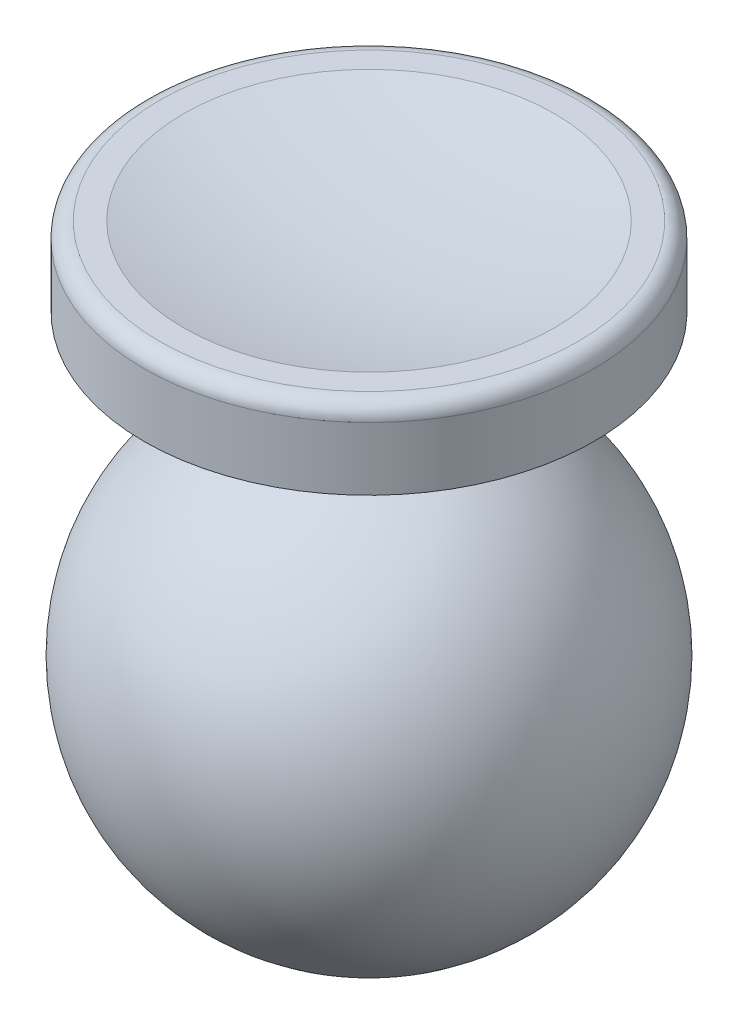
ISO-10303-21;
HEADER;
FILE_DESCRIPTION(('STEP AP214'),'2;1');
FILE_NAME('part.step','',(''),(''),'','','');
FILE_SCHEMA(('AUTOMOTIVE_DESIGN { 1 0 10303 214 1 1 1 1 }'));
ENDSEC;
DATA;
#1=APPLICATION_CONTEXT('core data for automotive mechanical design processes');
#2=APPLICATION_PROTOCOL_DEFINITION('international standard','automotive_design',2000,#1);
#3=PRODUCT_CONTEXT('',#1,'mechanical');
#4=PRODUCT('Part','Part','',(#3));
#5=PRODUCT_RELATED_PRODUCT_CATEGORY('part','',(#4));
#6=PRODUCT_DEFINITION_FORMATION('','',#4);
#7=PRODUCT_DEFINITION_CONTEXT('part definition',#1,'design');
#8=PRODUCT_DEFINITION('design','',#6,#7);
#9=PRODUCT_DEFINITION_SHAPE('','',#8);
#10=(LENGTH_UNIT() NAMED_UNIT(*) SI_UNIT(.MILLI.,.METRE.));
#11=(NAMED_UNIT(*) PLANE_ANGLE_UNIT() SI_UNIT($,.RADIAN.));
#12=(NAMED_UNIT(*) SI_UNIT($,.STERADIAN.) SOLID_ANGLE_UNIT());
#13=UNCERTAINTY_MEASURE_WITH_UNIT(LENGTH_MEASURE(1.E-05),#10,'distance_accuracy_value','');
#14=(GEOMETRIC_REPRESENTATION_CONTEXT(3) GLOBAL_UNCERTAINTY_ASSIGNED_CONTEXT((#13)) GLOBAL_UNIT_ASSIGNED_CONTEXT((#10,
#11,#12)) REPRESENTATION_CONTEXT('',''));
#15=CARTESIAN_POINT('',(0.,0.,0.));
#16=DIRECTION('',(0.,0.,1.));
#17=DIRECTION('',(1.,0.,0.));
#18=AXIS2_PLACEMENT_3D('',#15,#16,#17);
#19=CARTESIAN_POINT('',(0.,13.9389230915884,0.));
#20=DIRECTION('',(0.,1.,0.));
#21=DIRECTION('',(0.,0.,1.));
#22=AXIS2_PLACEMENT_3D('',#19,#20,#21);
#23=CYLINDRICAL_SURFACE('',#22,5.);
#24=CARTESIAN_POINT('',(0.,14.7997924617903,0.));
#25=DIRECTION('',(0.,1.,0.));
#26=DIRECTION('',(0.,0.,1.));
#27=AXIS2_PLACEMENT_3D('',#24,#25,#26);
#28=CIRCLE('',#27,5.);
#29=CARTESIAN_POINT('',(0.,14.7997924617903,5.));
#30=VERTEX_POINT('',#29);
#31=EDGE_CURVE('E56',#30,#30,#28,.F.);
#32=ORIENTED_EDGE('',*,*,#31,.T.);
#33=EDGE_LOOP('',(#32));
#34=FACE_BOUND('',#33,.T.);
#35=CARTESIAN_POINT('',(0.,14.2916059279565,0.));
#36=DIRECTION('',(0.,-1.,0.));
#37=DIRECTION('',(0.,0.,-1.));
#38=AXIS2_PLACEMENT_3D('',#35,#36,#37);
#39=CIRCLE('',#38,5.);
#40=CARTESIAN_POINT('',(0.,14.2916059279565,-5.));
#41=VERTEX_POINT('',#40);
#42=EDGE_CURVE('E61',#41,#41,#39,.F.);
#43=ORIENTED_EDGE('',*,*,#42,.T.);
#44=EDGE_LOOP('',(#43));
#45=FACE_BOUND('',#44,.T.);
#46=ADVANCED_FACE('F41',(#34,#45),#23,.T.);
#47=CARTESIAN_POINT('',(0.,15.5,0.));
#48=DIRECTION('',(0.,1.,0.));
#49=DIRECTION('',(0.,0.,1.));
#50=AXIS2_PLACEMENT_3D('',#47,#48,#49);
#51=CONICAL_SURFACE('',#50,5.,1.22173047639603);
#52=CARTESIAN_POINT('',(0.,15.7394850825762,0.));
#53=DIRECTION('',(0.,1.,0.));
#54=DIRECTION('',(0.,0.,1.));
#55=AXIS2_PLACEMENT_3D('',#52,#53,#54);
#56=CIRCLE('',#55,5.65797985667433);
#57=CARTESIAN_POINT('',(0.,15.7394850825762,5.65797985667433));
#58=VERTEX_POINT('',#57);
#59=EDGE_CURVE('E64',#58,#58,#56,.T.);
#60=ORIENTED_EDGE('',*,*,#59,.T.);
#61=EDGE_LOOP('',(#60));
#62=FACE_BOUND('',#61,.T.);
#63=CARTESIAN_POINT('',(0.,18.8761635643921,0.));
#64=DIRECTION('',(0.,1.,0.));
#65=DIRECTION('',(0.,0.,1.));
#66=AXIS2_PLACEMENT_3D('',#63,#64,#65);
#67=CIRCLE('',#66,14.2759331575529);
#68=CARTESIAN_POINT('',(0.,18.8761635643921,14.2759331575529));
#69=VERTEX_POINT('',#68);
#70=EDGE_CURVE('E67',#69,#69,#67,.T.);
#71=ORIENTED_EDGE('',*,*,#70,.F.);
#72=EDGE_LOOP('',(#71));
#73=FACE_BOUND('',#72,.T.);
#74=ADVANCED_FACE('F87',(#62,#73),#51,.T.);
#75=CARTESIAN_POINT('',(0.,13.9389230915884,0.));
#76=DIRECTION('',(0.,1.,0.));
#77=DIRECTION('',(0.,0.,1.));
#78=AXIS2_PLACEMENT_3D('',#75,#76,#77);
#79=CYLINDRICAL_SURFACE('',#78,14.2759331575529);
#80=CARTESIAN_POINT('',(0.,22.8761635643921,0.));
#81=DIRECTION('',(0.,-1.,0.));
#82=DIRECTION('',(0.,0.,-1.));
#83=AXIS2_PLACEMENT_3D('',#80,#81,#82);
#84=CIRCLE('',#83,14.2759331575529);
#85=CARTESIAN_POINT('',(0.,22.8761635643921,-14.2759331575529));
#86=VERTEX_POINT('',#85);
#87=EDGE_CURVE('E10',#86,#86,#84,.T.);
#88=ORIENTED_EDGE('',*,*,#87,.T.);
#89=EDGE_LOOP('',(#88));
#90=FACE_BOUND('',#89,.T.);
#91=ORIENTED_EDGE('',*,*,#70,.T.);
#92=EDGE_LOOP('',(#91));
#93=FACE_BOUND('',#92,.T.);
#94=ADVANCED_FACE('F78',(#90,#93),#79,.T.);
#95=CARTESIAN_POINT('',(11.7759331575529,23.8761635643921,0.));
#96=DIRECTION('',(0.,-1.,0.));
#97=DIRECTION('',(0.,0.,-1.));
#98=AXIS2_PLACEMENT_3D('',#95,#96,#97);
#99=PLANE('',#98);
#100=CARTESIAN_POINT('',(0.,23.8761635643921,0.));
#101=DIRECTION('',(0.,-1.,0.));
#102=DIRECTION('',(0.,0.,-1.));
#103=AXIS2_PLACEMENT_3D('',#100,#101,#102);
#104=CIRCLE('',#103,13.2759331575529);
#105=CARTESIAN_POINT('',(0.,23.8761635643921,-13.2759331575529));
#106=VERTEX_POINT('',#105);
#107=EDGE_CURVE('E48',#106,#106,#104,.F.);
#108=ORIENTED_EDGE('',*,*,#107,.T.);
#109=EDGE_LOOP('',(#108));
#110=FACE_BOUND('',#109,.T.);
#111=CARTESIAN_POINT('',(0.,23.8761635643921,0.));
#112=DIRECTION('',(0.,1.,0.));
#113=DIRECTION('',(0.,0.,1.));
#114=AXIS2_PLACEMENT_3D('',#111,#112,#113);
#115=CIRCLE('',#114,11.7759331575529);
#116=CARTESIAN_POINT('',(0.,23.8761635643921,11.7759331575529));
#117=VERTEX_POINT('',#116);
#118=EDGE_CURVE('E70',#117,#117,#115,.T.);
#119=ORIENTED_EDGE('',*,*,#118,.F.);
#120=EDGE_LOOP('',(#119));
#121=FACE_BOUND('',#120,.T.);
#122=ADVANCED_FACE('F76',(#110,#121),#99,.F.);
#123=CARTESIAN_POINT('',(0.,69.350364141443,0.));
#124=DIRECTION('',(0.,1.,0.));
#125=DIRECTION('',(1.,0.,0.));
#126=AXIS2_PLACEMENT_3D('',#123,#124,#125);
#127=SPHERICAL_SURFACE('',#126,46.9742005770509);
#128=ORIENTED_EDGE('',*,*,#118,.T.);
#129=EDGE_LOOP('',(#128));
#130=FACE_BOUND('',#129,.T.);
#131=ADVANCED_FACE('F74',(#130),#127,.F.);
#132=CARTESIAN_POINT('',(0.,0.,0.));
#133=DIRECTION('',(0.,1.,0.));
#134=DIRECTION('',(1.,0.,0.));
#135=AXIS2_PLACEMENT_3D('',#132,#133,#134);
#136=SPHERICAL_SURFACE('',#135,14.5);
#137=CARTESIAN_POINT('',(0.,13.3695668358302,0.));
#138=DIRECTION('',(0.,-1.,0.));
#139=DIRECTION('',(0.,0.,-1.));
#140=AXIS2_PLACEMENT_3D('',#137,#138,#139);
#141=CIRCLE('',#140,5.61290322580645);
#142=CARTESIAN_POINT('',(0.,13.3695668358302,-5.61290322580645));
#143=VERTEX_POINT('',#142);
#144=EDGE_CURVE('E52',#143,#143,#141,.T.);
#145=ORIENTED_EDGE('',*,*,#144,.T.);
#146=EDGE_LOOP('',(#145));
#147=FACE_BOUND('',#146,.T.);
#148=ADVANCED_FACE('F85',(#147),#136,.T.);
#149=CARTESIAN_POINT('',(0.,14.7997924617903,0.));
#150=DIRECTION('',(0.,1.,0.));
#151=DIRECTION('',(0.,0.,1.));
#152=AXIS2_PLACEMENT_3D('',#149,#150,#151);
#153=TOROIDAL_SURFACE('',#152,6.,1.);
#154=ORIENTED_EDGE('',*,*,#31,.F.);
#155=EDGE_LOOP('',(#154));
#156=FACE_BOUND('',#155,.T.);
#157=ORIENTED_EDGE('',*,*,#59,.F.);
#158=EDGE_LOOP('',(#157));
#159=FACE_BOUND('',#158,.T.);
#160=ADVANCED_FACE('F99',(#156,#159),#153,.F.);
#161=CARTESIAN_POINT('',(0.,14.2916059279565,0.));
#162=DIRECTION('',(0.,-1.,0.));
#163=DIRECTION('',(0.,0.,-1.));
#164=AXIS2_PLACEMENT_3D('',#161,#162,#163);
#165=TOROIDAL_SURFACE('',#164,6.,1.);
#166=ORIENTED_EDGE('',*,*,#144,.F.);
#167=EDGE_LOOP('',(#166));
#168=FACE_BOUND('',#167,.T.);
#169=ORIENTED_EDGE('',*,*,#42,.F.);
#170=EDGE_LOOP('',(#169));
#171=FACE_BOUND('',#170,.T.);
#172=ADVANCED_FACE('F101',(#168,#171),#165,.F.);
#173=CARTESIAN_POINT('',(0.,22.8761635643921,0.));
#174=DIRECTION('',(0.,-1.,0.));
#175=DIRECTION('',(0.,0.,-1.));
#176=AXIS2_PLACEMENT_3D('',#173,#174,#175);
#177=TOROIDAL_SURFACE('',#176,13.2759331575529,1.);
#178=ORIENTED_EDGE('',*,*,#87,.F.);
#179=EDGE_LOOP('',(#178));
#180=FACE_BOUND('',#179,.T.);
#181=ORIENTED_EDGE('',*,*,#107,.F.);
#182=EDGE_LOOP('',(#181));
#183=FACE_BOUND('',#182,.T.);
#184=ADVANCED_FACE('F43',(#180,#183),#177,.T.);
#185=CLOSED_SHELL('',(#46,#74,#94,#122,#131,#148,#160,#172,#184));
#186=MANIFOLD_SOLID_BREP('B2',#185);
#187=ADVANCED_BREP_SHAPE_REPRESENTATION('',(#18,#186),#14);
#188=SHAPE_DEFINITION_REPRESENTATION(#9,#187);
ENDSEC;
END-ISO-10303-21;
